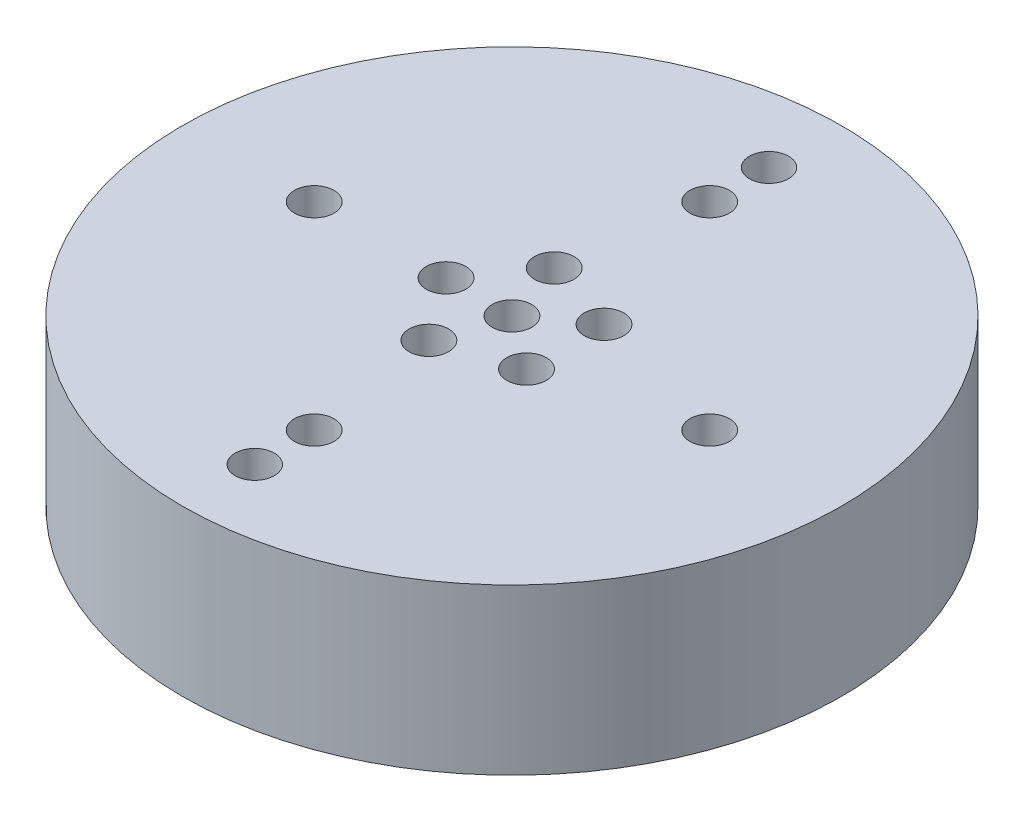
ISO-10303-21;
HEADER;
FILE_DESCRIPTION(('STEP AP214'),'2;1');
FILE_NAME('part.step','',(''),(''),'','','');
FILE_SCHEMA(('AUTOMOTIVE_DESIGN { 1 0 10303 214 1 1 1 1 }'));
ENDSEC;
DATA;
#1=APPLICATION_CONTEXT('core data for automotive mechanical design processes');
#2=APPLICATION_PROTOCOL_DEFINITION('international standard','automotive_design',2000,#1);
#3=PRODUCT_CONTEXT('',#1,'mechanical');
#4=PRODUCT('Part','Part','',(#3));
#5=PRODUCT_RELATED_PRODUCT_CATEGORY('part','',(#4));
#6=PRODUCT_DEFINITION_FORMATION('','',#4);
#7=PRODUCT_DEFINITION_CONTEXT('part definition',#1,'design');
#8=PRODUCT_DEFINITION('design','',#6,#7);
#9=PRODUCT_DEFINITION_SHAPE('','',#8);
#10=(LENGTH_UNIT() NAMED_UNIT(*) SI_UNIT(.MILLI.,.METRE.));
#11=(NAMED_UNIT(*) PLANE_ANGLE_UNIT() SI_UNIT($,.RADIAN.));
#12=(NAMED_UNIT(*) SI_UNIT($,.STERADIAN.) SOLID_ANGLE_UNIT());
#13=UNCERTAINTY_MEASURE_WITH_UNIT(LENGTH_MEASURE(1.E-05),#10,'distance_accuracy_value','');
#14=(GEOMETRIC_REPRESENTATION_CONTEXT(3) GLOBAL_UNCERTAINTY_ASSIGNED_CONTEXT((#13)) GLOBAL_UNIT_ASSIGNED_CONTEXT((#10,
#11,#12)) REPRESENTATION_CONTEXT('',''));
#15=CARTESIAN_POINT('',(0.,0.,0.));
#16=DIRECTION('',(0.,0.,1.));
#17=DIRECTION('',(1.,0.,0.));
#18=AXIS2_PLACEMENT_3D('',#15,#16,#17);
#19=CARTESIAN_POINT('',(0.,0.,0.));
#20=DIRECTION('',(0.,1.,0.));
#21=DIRECTION('',(0.,0.,1.));
#22=AXIS2_PLACEMENT_3D('',#19,#20,#21);
#23=PLANE('',#22);
#24=CARTESIAN_POINT('',(0.,0.,0.));
#25=DIRECTION('',(0.,1.,0.));
#26=DIRECTION('',(0.,0.,1.));
#27=AXIS2_PLACEMENT_3D('',#24,#25,#26);
#28=CIRCLE('',#27,12.7);
#29=CARTESIAN_POINT('',(0.,0.,12.7));
#30=VERTEX_POINT('',#29);
#31=EDGE_CURVE('E106',#30,#30,#28,.T.);
#32=ORIENTED_EDGE('',*,*,#31,.F.);
#33=EDGE_LOOP('',(#32));
#34=FACE_BOUND('',#33,.T.);
#35=CARTESIAN_POINT('',(0.,0.,9.91041782613396));
#36=DIRECTION('',(0.,-1.,0.));
#37=DIRECTION('',(0.,0.,-1.));
#38=AXIS2_PLACEMENT_3D('',#35,#36,#37);
#39=CIRCLE('',#38,0.75564999999999);
#40=CARTESIAN_POINT('',(0.389387783093403,0.,9.262819125643));
#41=VERTEX_POINT('',#40);
#42=CARTESIAN_POINT('',(-0.389387783093401,0.,9.26281912564299));
#43=VERTEX_POINT('',#42);
#44=EDGE_CURVE('E80',#41,#43,#39,.T.);
#45=ORIENTED_EDGE('',*,*,#44,.F.);
#46=CARTESIAN_POINT('',(0.,0.,0.));
#47=DIRECTION('',(0.,-1.,0.));
#48=DIRECTION('',(0.,0.,-1.));
#49=AXIS2_PLACEMENT_3D('',#46,#47,#48);
#50=CIRCLE('',#49,9.271);
#51=CARTESIAN_POINT('',(0.396175405780572,0.,-9.26253129807691));
#52=VERTEX_POINT('',#51);
#53=EDGE_CURVE('E90',#52,#41,#50,.T.);
#54=ORIENTED_EDGE('',*,*,#53,.F.);
#55=CARTESIAN_POINT('',(0.,0.,-9.906));
#56=DIRECTION('',(0.,-1.,0.));
#57=DIRECTION('',(0.,0.,-1.));
#58=AXIS2_PLACEMENT_3D('',#55,#56,#57);
#59=CIRCLE('',#58,0.75564999999999);
#60=CARTESIAN_POINT('',(-0.396175405780572,0.,-9.26253129807691));
#61=VERTEX_POINT('',#60);
#62=EDGE_CURVE('E115',#61,#52,#59,.T.);
#63=ORIENTED_EDGE('',*,*,#62,.F.);
#64=EDGE_CURVE('E91',#43,#61,#50,.T.);
#65=ORIENTED_EDGE('',*,*,#64,.F.);
#66=EDGE_LOOP('',(#45,#54,#63,#65));
#67=FACE_BOUND('',#66,.T.);
#68=ADVANCED_FACE('F38',(#34,#67),#23,.F.);
#69=CARTESIAN_POINT('',(0.,3.175,0.));
#70=DIRECTION('',(0.,-1.,0.));
#71=DIRECTION('',(0.,0.,-1.));
#72=AXIS2_PLACEMENT_3D('',#69,#70,#71);
#73=CYLINDRICAL_SURFACE('',#72,9.271);
#74=CARTESIAN_POINT('',(0.,3.175,0.));
#75=DIRECTION('',(0.,-1.,0.));
#76=DIRECTION('',(0.,0.,-1.));
#77=AXIS2_PLACEMENT_3D('',#74,#75,#76);
#78=CIRCLE('',#77,9.271);
#79=CARTESIAN_POINT('',(-0.38938778309341,3.175,9.26281912564299));
#80=VERTEX_POINT('',#79);
#81=CARTESIAN_POINT('',(-0.396175405780566,3.175,-9.26253129807693));
#82=VERTEX_POINT('',#81);
#83=EDGE_CURVE('E59',#80,#82,#78,.T.);
#84=ORIENTED_EDGE('',*,*,#83,.F.);
#85=DIRECTION('',(0.,-1.,0.));
#86=VECTOR('',#85,1.);
#87=CARTESIAN_POINT('',(-0.389387783093406,5.588,9.262819125643));
#88=LINE('',#87,#86);
#89=EDGE_CURVE('E52',#80,#43,#88,.T.);
#90=ORIENTED_EDGE('',*,*,#89,.T.);
#91=ORIENTED_EDGE('',*,*,#64,.T.);
#92=DIRECTION('',(0.,-1.,0.));
#93=VECTOR('',#92,1.);
#94=CARTESIAN_POINT('',(-0.396175405780563,5.588,-9.26253129807691));
#95=LINE('',#94,#93);
#96=EDGE_CURVE('E105',#61,#82,#95,.F.);
#97=ORIENTED_EDGE('',*,*,#96,.T.);
#98=EDGE_LOOP('',(#84,#90,#91,#97));
#99=FACE_BOUND('',#98,.T.);
#100=ADVANCED_FACE('F112',(#99),#73,.F.);
#101=CARTESIAN_POINT('',(0.,6.35,0.));
#102=DIRECTION('',(0.,-1.,0.));
#103=DIRECTION('',(0.,0.,-1.));
#104=AXIS2_PLACEMENT_3D('',#101,#102,#103);
#105=CYLINDRICAL_SURFACE('',#104,12.7);
#106=CARTESIAN_POINT('',(0.,6.35,0.));
#107=DIRECTION('',(0.,1.,0.));
#108=DIRECTION('',(0.,0.,1.));
#109=AXIS2_PLACEMENT_3D('',#106,#107,#108);
#110=CIRCLE('',#109,12.7);
#111=CARTESIAN_POINT('',(0.,6.35,12.7));
#112=VERTEX_POINT('',#111);
#113=EDGE_CURVE('E102',#112,#112,#110,.T.);
#114=ORIENTED_EDGE('',*,*,#113,.F.);
#115=EDGE_LOOP('',(#114));
#116=FACE_BOUND('',#115,.T.);
#117=ORIENTED_EDGE('',*,*,#31,.T.);
#118=EDGE_LOOP('',(#117));
#119=FACE_BOUND('',#118,.T.);
#120=ADVANCED_FACE('F40',(#116,#119),#105,.T.);
#121=CARTESIAN_POINT('',(0.,6.35,0.));
#122=DIRECTION('',(0.,1.,0.));
#123=DIRECTION('',(0.,0.,1.));
#124=AXIS2_PLACEMENT_3D('',#121,#122,#123);
#125=PLANE('',#124);
#126=CARTESIAN_POINT('',(-7.61999999999978,6.35,2.1611957610695E-13));
#127=DIRECTION('',(0.,1.,0.));
#128=DIRECTION('',(0.,0.,1.));
#129=AXIS2_PLACEMENT_3D('',#126,#127,#128);
#130=CIRCLE('',#129,0.762000000000346);
#131=CARTESIAN_POINT('',(-7.61999999999978,6.35,0.762000000000562));
#132=VERTEX_POINT('',#131);
#133=EDGE_CURVE('E252',#132,#132,#130,.T.);
#134=ORIENTED_EDGE('',*,*,#133,.F.);
#135=EDGE_LOOP('',(#134));
#136=FACE_BOUND('',#135,.T.);
#137=CARTESIAN_POINT('',(2.05490316571238,6.35,-1.49297454082287));
#138=DIRECTION('',(0.,1.,0.));
#139=DIRECTION('',(0.,0.,1.));
#140=AXIS2_PLACEMENT_3D('',#137,#138,#139);
#141=CIRCLE('',#140,0.762);
#142=CARTESIAN_POINT('',(2.05490316571238,6.35,-0.73097454082287));
#143=VERTEX_POINT('',#142);
#144=EDGE_CURVE('E217',#143,#143,#141,.T.);
#145=ORIENTED_EDGE('',*,*,#144,.F.);
#146=EDGE_LOOP('',(#145));
#147=FACE_BOUND('',#146,.T.);
#148=CARTESIAN_POINT('',(-0.78490316571236,6.35,-2.41568355138969));
#149=DIRECTION('',(0.,1.,0.));
#150=DIRECTION('',(0.,0.,1.));
#151=AXIS2_PLACEMENT_3D('',#148,#149,#150);
#152=CIRCLE('',#151,0.762);
#153=CARTESIAN_POINT('',(-0.78490316571236,6.35,-1.65368355138969));
#154=VERTEX_POINT('',#153);
#155=EDGE_CURVE('E230',#154,#154,#152,.T.);
#156=ORIENTED_EDGE('',*,*,#155,.F.);
#157=EDGE_LOOP('',(#156));
#158=FACE_BOUND('',#157,.T.);
#159=CARTESIAN_POINT('',(0.,6.35,-7.62));
#160=DIRECTION('',(0.,1.,0.));
#161=DIRECTION('',(0.,0.,1.));
#162=AXIS2_PLACEMENT_3D('',#159,#160,#161);
#163=CIRCLE('',#162,0.762);
#164=CARTESIAN_POINT('',(0.,6.35,-6.858));
#165=VERTEX_POINT('',#164);
#166=EDGE_CURVE('E229',#165,#165,#163,.T.);
#167=ORIENTED_EDGE('',*,*,#166,.F.);
#168=EDGE_LOOP('',(#167));
#169=FACE_BOUND('',#168,.T.);
#170=CARTESIAN_POINT('',(-2.54,6.35,0.));
#171=DIRECTION('',(0.,1.,0.));
#172=DIRECTION('',(0.,0.,1.));
#173=AXIS2_PLACEMENT_3D('',#170,#171,#172);
#174=CIRCLE('',#173,0.762);
#175=CARTESIAN_POINT('',(-2.54,6.35,0.762));
#176=VERTEX_POINT('',#175);
#177=EDGE_CURVE('E242',#176,#176,#174,.T.);
#178=ORIENTED_EDGE('',*,*,#177,.F.);
#179=EDGE_LOOP('',(#178));
#180=FACE_BOUND('',#179,.T.);
#181=CARTESIAN_POINT('',(4.30372790491999E-13,6.35,7.62));
#182=DIRECTION('',(0.,1.,0.));
#183=DIRECTION('',(0.,0.,1.));
#184=AXIS2_PLACEMENT_3D('',#181,#182,#183);
#185=CIRCLE('',#184,0.762000000000463);
#186=CARTESIAN_POINT('',(4.30372790491999E-13,6.35,8.38200000000046));
#187=VERTEX_POINT('',#186);
#188=EDGE_CURVE('E208',#187,#187,#185,.T.);
#189=ORIENTED_EDGE('',*,*,#188,.F.);
#190=EDGE_LOOP('',(#189));
#191=FACE_BOUND('',#190,.T.);
#192=CARTESIAN_POINT('',(7.62000000000021,6.35,-2.15186395246E-13));
#193=DIRECTION('',(0.,1.,0.));
#194=DIRECTION('',(0.,0.,1.));
#195=AXIS2_PLACEMENT_3D('',#192,#193,#194);
#196=CIRCLE('',#195,0.762000000000169);
#197=CARTESIAN_POINT('',(7.62000000000021,6.35,0.761999999999954));
#198=VERTEX_POINT('',#197);
#199=EDGE_CURVE('E201',#198,#198,#196,.T.);
#200=ORIENTED_EDGE('',*,*,#199,.F.);
#201=EDGE_LOOP('',(#200));
#202=FACE_BOUND('',#201,.T.);
#203=CARTESIAN_POINT('',(-0.784903165712394,6.35,2.41568355138968));
#204=DIRECTION('',(0.,1.,0.));
#205=DIRECTION('',(0.,0.,1.));
#206=AXIS2_PLACEMENT_3D('',#203,#204,#205);
#207=CIRCLE('',#206,0.762);
#208=CARTESIAN_POINT('',(-0.784903165712394,6.35,3.17768355138968));
#209=VERTEX_POINT('',#208);
#210=EDGE_CURVE('E205',#209,#209,#207,.T.);
#211=ORIENTED_EDGE('',*,*,#210,.F.);
#212=EDGE_LOOP('',(#211));
#213=FACE_BOUND('',#212,.T.);
#214=CARTESIAN_POINT('',(2.05490316571235,6.35,1.4929745408229));
#215=DIRECTION('',(0.,1.,0.));
#216=DIRECTION('',(0.,0.,1.));
#217=AXIS2_PLACEMENT_3D('',#214,#215,#216);
#218=CIRCLE('',#217,0.762);
#219=CARTESIAN_POINT('',(2.05490316571235,6.35,2.2549745408229));
#220=VERTEX_POINT('',#219);
#221=EDGE_CURVE('E218',#220,#220,#218,.T.);
#222=ORIENTED_EDGE('',*,*,#221,.F.);
#223=EDGE_LOOP('',(#222));
#224=FACE_BOUND('',#223,.T.);
#225=CARTESIAN_POINT('',(0.,6.35,0.));
#226=DIRECTION('',(0.,1.,0.));
#227=DIRECTION('',(0.,0.,1.));
#228=AXIS2_PLACEMENT_3D('',#225,#226,#227);
#229=CIRCLE('',#228,0.762);
#230=CARTESIAN_POINT('',(0.,6.35,0.762));
#231=VERTEX_POINT('',#230);
#232=EDGE_CURVE('E241',#231,#231,#229,.T.);
#233=ORIENTED_EDGE('',*,*,#232,.F.);
#234=EDGE_LOOP('',(#233));
#235=FACE_BOUND('',#234,.T.);
#236=CARTESIAN_POINT('',(0.,6.35,9.91041782613396));
#237=DIRECTION('',(0.,1.,0.));
#238=DIRECTION('',(0.,0.,1.));
#239=AXIS2_PLACEMENT_3D('',#236,#237,#238);
#240=CIRCLE('',#239,0.755649999999988);
#241=CARTESIAN_POINT('',(0.,6.35,10.6660678261339));
#242=VERTEX_POINT('',#241);
#243=EDGE_CURVE('E117',#242,#242,#240,.T.);
#244=ORIENTED_EDGE('',*,*,#243,.F.);
#245=EDGE_LOOP('',(#244));
#246=FACE_BOUND('',#245,.T.);
#247=CARTESIAN_POINT('',(0.,6.35,-9.906));
#248=DIRECTION('',(0.,1.,0.));
#249=DIRECTION('',(0.,0.,1.));
#250=AXIS2_PLACEMENT_3D('',#247,#248,#249);
#251=CIRCLE('',#250,0.755649999999988);
#252=CARTESIAN_POINT('',(0.,6.35,-9.15035000000001));
#253=VERTEX_POINT('',#252);
#254=EDGE_CURVE('E99',#253,#253,#251,.T.);
#255=ORIENTED_EDGE('',*,*,#254,.F.);
#256=EDGE_LOOP('',(#255));
#257=FACE_BOUND('',#256,.T.);
#258=ORIENTED_EDGE('',*,*,#113,.T.);
#259=EDGE_LOOP('',(#258));
#260=FACE_BOUND('',#259,.T.);
#261=ADVANCED_FACE('F127',(#136,#147,#158,#169,#180,#191,#202,#213,#224,#235,#246,#257,#260),
#125,.T.);
#262=ORIENTED_EDGE('',*,*,#53,.T.);
#263=DIRECTION('',(0.,-1.,0.));
#264=VECTOR('',#263,1.);
#265=CARTESIAN_POINT('',(0.389387783093407,5.588,9.262819125643));
#266=LINE('',#265,#264);
#267=CARTESIAN_POINT('',(0.389387783093411,3.175,9.26281912564299));
#268=VERTEX_POINT('',#267);
#269=EDGE_CURVE('E77',#41,#268,#266,.F.);
#270=ORIENTED_EDGE('',*,*,#269,.T.);
#271=CARTESIAN_POINT('',(0.396175405780552,3.175,-9.26253129807693));
#272=VERTEX_POINT('',#271);
#273=EDGE_CURVE('E97',#272,#268,#78,.T.);
#274=ORIENTED_EDGE('',*,*,#273,.F.);
#275=DIRECTION('',(0.,-1.,0.));
#276=VECTOR('',#275,1.);
#277=CARTESIAN_POINT('',(0.396175405780563,5.588,-9.26253129807691));
#278=LINE('',#277,#276);
#279=EDGE_CURVE('E46',#272,#52,#278,.T.);
#280=ORIENTED_EDGE('',*,*,#279,.T.);
#281=EDGE_LOOP('',(#262,#270,#274,#280));
#282=FACE_BOUND('',#281,.T.);
#283=ADVANCED_FACE('F95',(#282),#73,.F.);
#284=CARTESIAN_POINT('',(0.,3.175,0.));
#285=DIRECTION('',(0.,-1.,0.));
#286=DIRECTION('',(0.,0.,-1.));
#287=AXIS2_PLACEMENT_3D('',#284,#285,#286);
#288=PLANE('',#287);
#289=CARTESIAN_POINT('',(-7.61999999999978,3.175,2.1611957610695E-13));
#290=DIRECTION('',(0.,1.,0.));
#291=DIRECTION('',(0.,0.,1.));
#292=AXIS2_PLACEMENT_3D('',#289,#290,#291);
#293=CIRCLE('',#292,0.762000000000346);
#294=CARTESIAN_POINT('',(-7.61999999999978,3.175,0.762000000000562));
#295=VERTEX_POINT('',#294);
#296=EDGE_CURVE('E213',#295,#295,#293,.T.);
#297=ORIENTED_EDGE('',*,*,#296,.T.);
#298=EDGE_LOOP('',(#297));
#299=FACE_BOUND('',#298,.T.);
#300=CARTESIAN_POINT('',(2.05490316571238,3.175,-1.49297454082287));
#301=DIRECTION('',(0.,1.,0.));
#302=DIRECTION('',(0.,0.,1.));
#303=AXIS2_PLACEMENT_3D('',#300,#301,#302);
#304=CIRCLE('',#303,0.762);
#305=CARTESIAN_POINT('',(2.05490316571238,3.175,-0.73097454082287));
#306=VERTEX_POINT('',#305);
#307=EDGE_CURVE('E233',#306,#306,#304,.T.);
#308=ORIENTED_EDGE('',*,*,#307,.T.);
#309=EDGE_LOOP('',(#308));
#310=FACE_BOUND('',#309,.T.);
#311=CARTESIAN_POINT('',(-0.78490316571236,3.175,-2.41568355138969));
#312=DIRECTION('',(0.,1.,0.));
#313=DIRECTION('',(0.,0.,1.));
#314=AXIS2_PLACEMENT_3D('',#311,#312,#313);
#315=CIRCLE('',#314,0.762);
#316=CARTESIAN_POINT('',(-0.78490316571236,3.175,-1.65368355138969));
#317=VERTEX_POINT('',#316);
#318=EDGE_CURVE('E226',#317,#317,#315,.T.);
#319=ORIENTED_EDGE('',*,*,#318,.T.);
#320=EDGE_LOOP('',(#319));
#321=FACE_BOUND('',#320,.T.);
#322=CARTESIAN_POINT('',(0.,3.175,-7.62));
#323=DIRECTION('',(0.,1.,0.));
#324=DIRECTION('',(0.,0.,1.));
#325=AXIS2_PLACEMENT_3D('',#322,#323,#324);
#326=CIRCLE('',#325,0.762);
#327=CARTESIAN_POINT('',(0.,3.175,-6.858));
#328=VERTEX_POINT('',#327);
#329=EDGE_CURVE('E245',#328,#328,#326,.T.);
#330=ORIENTED_EDGE('',*,*,#329,.T.);
#331=EDGE_LOOP('',(#330));
#332=FACE_BOUND('',#331,.T.);
#333=CARTESIAN_POINT('',(-2.54,3.175,0.));
#334=DIRECTION('',(0.,1.,0.));
#335=DIRECTION('',(0.,0.,1.));
#336=AXIS2_PLACEMENT_3D('',#333,#334,#335);
#337=CIRCLE('',#336,0.762);
#338=CARTESIAN_POINT('',(-2.54,3.175,0.762));
#339=VERTEX_POINT('',#338);
#340=EDGE_CURVE('E238',#339,#339,#337,.T.);
#341=ORIENTED_EDGE('',*,*,#340,.T.);
#342=EDGE_LOOP('',(#341));
#343=FACE_BOUND('',#342,.T.);
#344=CARTESIAN_POINT('',(4.30372790491999E-13,3.175,7.62));
#345=DIRECTION('',(0.,1.,0.));
#346=DIRECTION('',(0.,0.,1.));
#347=AXIS2_PLACEMENT_3D('',#344,#345,#346);
#348=CIRCLE('',#347,0.762000000000463);
#349=CARTESIAN_POINT('',(4.30372790491999E-13,3.175,8.38200000000046));
#350=VERTEX_POINT('',#349);
#351=EDGE_CURVE('E203',#350,#350,#348,.T.);
#352=ORIENTED_EDGE('',*,*,#351,.T.);
#353=EDGE_LOOP('',(#352));
#354=FACE_BOUND('',#353,.T.);
#355=CARTESIAN_POINT('',(7.62000000000021,3.175,-2.15186395246E-13));
#356=DIRECTION('',(0.,1.,0.));
#357=DIRECTION('',(0.,0.,1.));
#358=AXIS2_PLACEMENT_3D('',#355,#356,#357);
#359=CIRCLE('',#358,0.762000000000169);
#360=CARTESIAN_POINT('',(7.62000000000021,3.175,0.761999999999954));
#361=VERTEX_POINT('',#360);
#362=EDGE_CURVE('E198',#361,#361,#359,.T.);
#363=ORIENTED_EDGE('',*,*,#362,.T.);
#364=EDGE_LOOP('',(#363));
#365=FACE_BOUND('',#364,.T.);
#366=CARTESIAN_POINT('',(-0.784903165712394,3.175,2.41568355138968));
#367=DIRECTION('',(0.,1.,0.));
#368=DIRECTION('',(0.,0.,1.));
#369=AXIS2_PLACEMENT_3D('',#366,#367,#368);
#370=CIRCLE('',#369,0.762);
#371=CARTESIAN_POINT('',(-0.784903165712394,3.175,3.17768355138968));
#372=VERTEX_POINT('',#371);
#373=EDGE_CURVE('E221',#372,#372,#370,.T.);
#374=ORIENTED_EDGE('',*,*,#373,.T.);
#375=EDGE_LOOP('',(#374));
#376=FACE_BOUND('',#375,.T.);
#377=CARTESIAN_POINT('',(2.05490316571235,3.175,1.4929745408229));
#378=DIRECTION('',(0.,1.,0.));
#379=DIRECTION('',(0.,0.,1.));
#380=AXIS2_PLACEMENT_3D('',#377,#378,#379);
#381=CIRCLE('',#380,0.762);
#382=CARTESIAN_POINT('',(2.05490316571235,3.175,2.2549745408229));
#383=VERTEX_POINT('',#382);
#384=EDGE_CURVE('E214',#383,#383,#381,.T.);
#385=ORIENTED_EDGE('',*,*,#384,.T.);
#386=EDGE_LOOP('',(#385));
#387=FACE_BOUND('',#386,.T.);
#388=CARTESIAN_POINT('',(0.,3.175,0.));
#389=DIRECTION('',(0.,1.,0.));
#390=DIRECTION('',(0.,0.,1.));
#391=AXIS2_PLACEMENT_3D('',#388,#389,#390);
#392=CIRCLE('',#391,0.762);
#393=CARTESIAN_POINT('',(0.,3.175,0.762));
#394=VERTEX_POINT('',#393);
#395=EDGE_CURVE('E92',#394,#394,#392,.T.);
#396=ORIENTED_EDGE('',*,*,#395,.T.);
#397=EDGE_LOOP('',(#396));
#398=FACE_BOUND('',#397,.T.);
#399=CARTESIAN_POINT('',(0.,3.175,9.91041782613396));
#400=DIRECTION('',(0.,-1.,0.));
#401=DIRECTION('',(0.,0.,-1.));
#402=AXIS2_PLACEMENT_3D('',#399,#400,#401);
#403=CIRCLE('',#402,0.755649999999988);
#404=EDGE_CURVE('E11',#80,#268,#403,.T.);
#405=ORIENTED_EDGE('',*,*,#404,.F.);
#406=ORIENTED_EDGE('',*,*,#83,.T.);
#407=CARTESIAN_POINT('',(0.,3.175,-9.906));
#408=DIRECTION('',(0.,-1.,0.));
#409=DIRECTION('',(0.,0.,-1.));
#410=AXIS2_PLACEMENT_3D('',#407,#408,#409);
#411=CIRCLE('',#410,0.755649999999988);
#412=EDGE_CURVE('E116',#272,#82,#411,.T.);
#413=ORIENTED_EDGE('',*,*,#412,.F.);
#414=ORIENTED_EDGE('',*,*,#273,.T.);
#415=EDGE_LOOP('',(#405,#406,#413,#414));
#416=FACE_BOUND('',#415,.T.);
#417=ADVANCED_FACE('F145',(#299,#310,#321,#332,#343,#354,#365,#376,#387,#398,#416),#288,.T.);
#418=CARTESIAN_POINT('',(0.,0.,-9.906));
#419=DIRECTION('',(0.,-1.,0.));
#420=DIRECTION('',(0.,0.,-1.));
#421=AXIS2_PLACEMENT_3D('',#418,#419,#420);
#422=CYLINDRICAL_SURFACE('',#421,0.755649999999988);
#423=ORIENTED_EDGE('',*,*,#254,.T.);
#424=EDGE_LOOP('',(#423));
#425=FACE_BOUND('',#424,.T.);
#426=ORIENTED_EDGE('',*,*,#412,.T.);
#427=ORIENTED_EDGE('',*,*,#96,.F.);
#428=ORIENTED_EDGE('',*,*,#62,.T.);
#429=ORIENTED_EDGE('',*,*,#279,.F.);
#430=EDGE_LOOP('',(#426,#427,#428,#429));
#431=FACE_BOUND('',#430,.T.);
#432=ADVANCED_FACE('F114',(#425,#431),#422,.F.);
#433=CARTESIAN_POINT('',(0.,0.,9.91041782613396));
#434=DIRECTION('',(0.,-1.,0.));
#435=DIRECTION('',(0.,0.,-1.));
#436=AXIS2_PLACEMENT_3D('',#433,#434,#435);
#437=CYLINDRICAL_SURFACE('',#436,0.755649999999988);
#438=ORIENTED_EDGE('',*,*,#243,.T.);
#439=EDGE_LOOP('',(#438));
#440=FACE_BOUND('',#439,.T.);
#441=ORIENTED_EDGE('',*,*,#404,.T.);
#442=ORIENTED_EDGE('',*,*,#269,.F.);
#443=ORIENTED_EDGE('',*,*,#44,.T.);
#444=ORIENTED_EDGE('',*,*,#89,.F.);
#445=EDGE_LOOP('',(#441,#442,#443,#444));
#446=FACE_BOUND('',#445,.T.);
#447=ADVANCED_FACE('F79',(#440,#446),#437,.F.);
#448=CARTESIAN_POINT('',(0.,3.175,0.));
#449=DIRECTION('',(0.,1.,0.));
#450=DIRECTION('',(0.,0.,1.));
#451=AXIS2_PLACEMENT_3D('',#448,#449,#450);
#452=CYLINDRICAL_SURFACE('',#451,0.762);
#453=ORIENTED_EDGE('',*,*,#395,.F.);
#454=EDGE_LOOP('',(#453));
#455=FACE_BOUND('',#454,.T.);
#456=ORIENTED_EDGE('',*,*,#232,.T.);
#457=EDGE_LOOP('',(#456));
#458=FACE_BOUND('',#457,.T.);
#459=ADVANCED_FACE('F153',(#455,#458),#452,.F.);
#460=CARTESIAN_POINT('',(2.05490316571235,3.175,1.4929745408229));
#461=DIRECTION('',(0.,1.,0.));
#462=DIRECTION('',(0.,0.,1.));
#463=AXIS2_PLACEMENT_3D('',#460,#461,#462);
#464=CYLINDRICAL_SURFACE('',#463,0.762);
#465=ORIENTED_EDGE('',*,*,#384,.F.);
#466=EDGE_LOOP('',(#465));
#467=FACE_BOUND('',#466,.T.);
#468=ORIENTED_EDGE('',*,*,#221,.T.);
#469=EDGE_LOOP('',(#468));
#470=FACE_BOUND('',#469,.T.);
#471=ADVANCED_FACE('F157',(#467,#470),#464,.F.);
#472=CARTESIAN_POINT('',(-0.784903165712394,3.175,2.41568355138968));
#473=DIRECTION('',(0.,1.,0.));
#474=DIRECTION('',(0.,0.,1.));
#475=AXIS2_PLACEMENT_3D('',#472,#473,#474);
#476=CYLINDRICAL_SURFACE('',#475,0.762);
#477=ORIENTED_EDGE('',*,*,#373,.F.);
#478=EDGE_LOOP('',(#477));
#479=FACE_BOUND('',#478,.T.);
#480=ORIENTED_EDGE('',*,*,#210,.T.);
#481=EDGE_LOOP('',(#480));
#482=FACE_BOUND('',#481,.T.);
#483=ADVANCED_FACE('F180',(#479,#482),#476,.F.);
#484=CARTESIAN_POINT('',(7.62000000000021,3.175,-2.15186395246E-13));
#485=DIRECTION('',(0.,1.,0.));
#486=DIRECTION('',(0.,0.,1.));
#487=AXIS2_PLACEMENT_3D('',#484,#485,#486);
#488=CYLINDRICAL_SURFACE('',#487,0.762000000000169);
#489=ORIENTED_EDGE('',*,*,#362,.F.);
#490=EDGE_LOOP('',(#489));
#491=FACE_BOUND('',#490,.T.);
#492=ORIENTED_EDGE('',*,*,#199,.T.);
#493=EDGE_LOOP('',(#492));
#494=FACE_BOUND('',#493,.T.);
#495=ADVANCED_FACE('F183',(#491,#494),#488,.F.);
#496=CARTESIAN_POINT('',(4.30372790491999E-13,3.175,7.62));
#497=DIRECTION('',(0.,1.,0.));
#498=DIRECTION('',(0.,0.,1.));
#499=AXIS2_PLACEMENT_3D('',#496,#497,#498);
#500=CYLINDRICAL_SURFACE('',#499,0.762000000000463);
#501=ORIENTED_EDGE('',*,*,#351,.F.);
#502=EDGE_LOOP('',(#501));
#503=FACE_BOUND('',#502,.T.);
#504=ORIENTED_EDGE('',*,*,#188,.T.);
#505=EDGE_LOOP('',(#504));
#506=FACE_BOUND('',#505,.T.);
#507=ADVANCED_FACE('F172',(#503,#506),#500,.F.);
#508=CARTESIAN_POINT('',(-2.54,3.175,0.));
#509=DIRECTION('',(0.,1.,0.));
#510=DIRECTION('',(0.,0.,1.));
#511=AXIS2_PLACEMENT_3D('',#508,#509,#510);
#512=CYLINDRICAL_SURFACE('',#511,0.762);
#513=ORIENTED_EDGE('',*,*,#340,.F.);
#514=EDGE_LOOP('',(#513));
#515=FACE_BOUND('',#514,.T.);
#516=ORIENTED_EDGE('',*,*,#177,.T.);
#517=EDGE_LOOP('',(#516));
#518=FACE_BOUND('',#517,.T.);
#519=ADVANCED_FACE('F168',(#515,#518),#512,.F.);
#520=CARTESIAN_POINT('',(0.,3.175,-7.62));
#521=DIRECTION('',(0.,1.,0.));
#522=DIRECTION('',(0.,0.,1.));
#523=AXIS2_PLACEMENT_3D('',#520,#521,#522);
#524=CYLINDRICAL_SURFACE('',#523,0.762);
#525=ORIENTED_EDGE('',*,*,#329,.F.);
#526=EDGE_LOOP('',(#525));
#527=FACE_BOUND('',#526,.T.);
#528=ORIENTED_EDGE('',*,*,#166,.T.);
#529=EDGE_LOOP('',(#528));
#530=FACE_BOUND('',#529,.T.);
#531=ADVANCED_FACE('F164',(#527,#530),#524,.F.);
#532=CARTESIAN_POINT('',(-0.78490316571236,3.175,-2.41568355138969));
#533=DIRECTION('',(0.,1.,0.));
#534=DIRECTION('',(0.,0.,1.));
#535=AXIS2_PLACEMENT_3D('',#532,#533,#534);
#536=CYLINDRICAL_SURFACE('',#535,0.762);
#537=ORIENTED_EDGE('',*,*,#318,.F.);
#538=EDGE_LOOP('',(#537));
#539=FACE_BOUND('',#538,.T.);
#540=ORIENTED_EDGE('',*,*,#155,.T.);
#541=EDGE_LOOP('',(#540));
#542=FACE_BOUND('',#541,.T.);
#543=ADVANCED_FACE('F167',(#539,#542),#536,.F.);
#544=CARTESIAN_POINT('',(2.05490316571238,3.175,-1.49297454082287));
#545=DIRECTION('',(0.,1.,0.));
#546=DIRECTION('',(0.,0.,1.));
#547=AXIS2_PLACEMENT_3D('',#544,#545,#546);
#548=CYLINDRICAL_SURFACE('',#547,0.762);
#549=ORIENTED_EDGE('',*,*,#307,.F.);
#550=EDGE_LOOP('',(#549));
#551=FACE_BOUND('',#550,.T.);
#552=ORIENTED_EDGE('',*,*,#144,.T.);
#553=EDGE_LOOP('',(#552));
#554=FACE_BOUND('',#553,.T.);
#555=ADVANCED_FACE('F162',(#551,#554),#548,.F.);
#556=CARTESIAN_POINT('',(-7.61999999999978,3.175,2.1611957610695E-13));
#557=DIRECTION('',(0.,1.,0.));
#558=DIRECTION('',(0.,0.,1.));
#559=AXIS2_PLACEMENT_3D('',#556,#557,#558);
#560=CYLINDRICAL_SURFACE('',#559,0.762000000000346);
#561=ORIENTED_EDGE('',*,*,#296,.F.);
#562=EDGE_LOOP('',(#561));
#563=FACE_BOUND('',#562,.T.);
#564=ORIENTED_EDGE('',*,*,#133,.T.);
#565=EDGE_LOOP('',(#564));
#566=FACE_BOUND('',#565,.T.);
#567=ADVANCED_FACE('F159',(#563,#566),#560,.F.);
#568=CLOSED_SHELL('',(#68,#100,#120,#261,#283,#417,#432,#447,#459,#471,#483,#495,#507,#519,#531,
#543,#555,#567));
#569=MANIFOLD_SOLID_BREP('B2',#568);
#570=ADVANCED_BREP_SHAPE_REPRESENTATION('',(#18,#569),#14);
#571=SHAPE_DEFINITION_REPRESENTATION(#9,#570);
ENDSEC;
END-ISO-10303-21;
